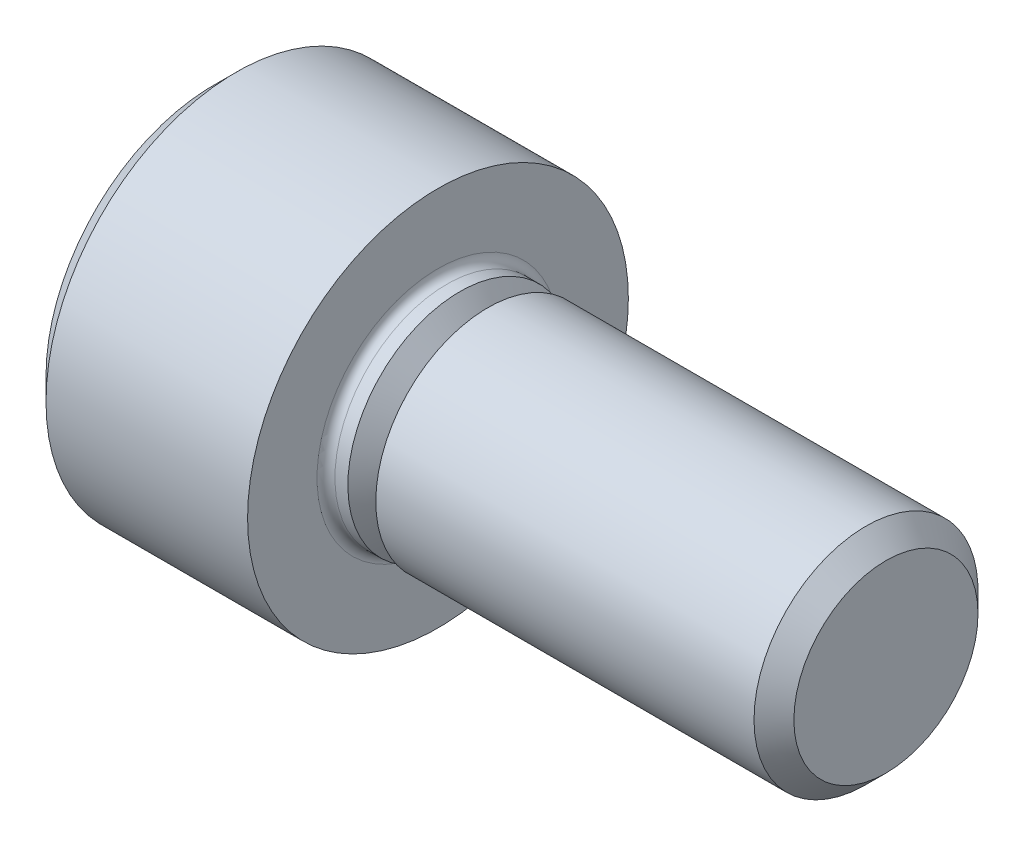
ISO-10303-21;
HEADER;
FILE_DESCRIPTION(('STEP AP214'),'2;1');
FILE_NAME('part.step','',(''),(''),'','','');
FILE_SCHEMA(('AUTOMOTIVE_DESIGN { 1 0 10303 214 1 1 1 1 }'));
ENDSEC;
DATA;
#1=APPLICATION_CONTEXT('core data for automotive mechanical design processes');
#2=APPLICATION_PROTOCOL_DEFINITION('international standard','automotive_design',2000,#1);
#3=PRODUCT_CONTEXT('',#1,'mechanical');
#4=PRODUCT('Part','Part','',(#3));
#5=PRODUCT_RELATED_PRODUCT_CATEGORY('part','',(#4));
#6=PRODUCT_DEFINITION_FORMATION('','',#4);
#7=PRODUCT_DEFINITION_CONTEXT('part definition',#1,'design');
#8=PRODUCT_DEFINITION('design','',#6,#7);
#9=PRODUCT_DEFINITION_SHAPE('','',#8);
#10=(LENGTH_UNIT() NAMED_UNIT(*) SI_UNIT(.MILLI.,.METRE.));
#11=(NAMED_UNIT(*) PLANE_ANGLE_UNIT() SI_UNIT($,.RADIAN.));
#12=(NAMED_UNIT(*) SI_UNIT($,.STERADIAN.) SOLID_ANGLE_UNIT());
#13=UNCERTAINTY_MEASURE_WITH_UNIT(LENGTH_MEASURE(1.E-05),#10,'distance_accuracy_value','');
#14=(GEOMETRIC_REPRESENTATION_CONTEXT(3) GLOBAL_UNCERTAINTY_ASSIGNED_CONTEXT((#13)) GLOBAL_UNIT_ASSIGNED_CONTEXT((#10,
#11,#12)) REPRESENTATION_CONTEXT('',''));
#15=CARTESIAN_POINT('',(0.,0.,0.));
#16=DIRECTION('',(0.,0.,1.));
#17=DIRECTION('',(1.,0.,0.));
#18=AXIS2_PLACEMENT_3D('',#15,#16,#17);
#19=CARTESIAN_POINT('',(0.,0.,0.));
#20=DIRECTION('',(-1.,0.,0.));
#21=DIRECTION('',(0.,0.,1.));
#22=AXIS2_PLACEMENT_3D('',#19,#20,#21);
#23=PLANE('',#22);
#24=DIRECTION('',(0.,-0.5,0.866025403784438));
#25=VECTOR('',#24,1.);
#26=CARTESIAN_POINT('',(0.,2.35789849937043,0.));
#27=LINE('',#26,#25);
#28=CARTESIAN_POINT('',(0.,2.35789849937043,0.));
#29=VERTEX_POINT('',#28);
#30=CARTESIAN_POINT('',(0.,1.17894924968521,2.042));
#31=VERTEX_POINT('',#30);
#32=EDGE_CURVE('E247',#29,#31,#27,.T.);
#33=ORIENTED_EDGE('',*,*,#32,.T.);
#34=DIRECTION('',(0.,1.,0.));
#35=VECTOR('',#34,1.);
#36=CARTESIAN_POINT('',(0.,-1.17894924968522,2.042));
#37=LINE('',#36,#35);
#38=CARTESIAN_POINT('',(0.,-1.17894924968522,2.042));
#39=VERTEX_POINT('',#38);
#40=EDGE_CURVE('E131',#39,#31,#37,.T.);
#41=ORIENTED_EDGE('',*,*,#40,.F.);
#42=DIRECTION('',(0.,-0.500000000000001,-0.866025403784438));
#43=VECTOR('',#42,1.);
#44=CARTESIAN_POINT('',(0.,-1.17894924968522,2.042));
#45=LINE('',#44,#43);
#46=CARTESIAN_POINT('',(0.,-2.35789849937044,0.));
#47=VERTEX_POINT('',#46);
#48=EDGE_CURVE('E266',#39,#47,#45,.T.);
#49=ORIENTED_EDGE('',*,*,#48,.T.);
#50=DIRECTION('',(0.,0.5,-0.866025403784439));
#51=VECTOR('',#50,1.);
#52=CARTESIAN_POINT('',(0.,-2.35789849937044,0.));
#53=LINE('',#52,#51);
#54=CARTESIAN_POINT('',(0.,-1.17894924968522,-2.042));
#55=VERTEX_POINT('',#54);
#56=EDGE_CURVE('E269',#47,#55,#53,.T.);
#57=ORIENTED_EDGE('',*,*,#56,.T.);
#58=DIRECTION('',(0.,-1.,0.));
#59=VECTOR('',#58,1.);
#60=CARTESIAN_POINT('',(0.,1.17894924968521,-2.042));
#61=LINE('',#60,#59);
#62=CARTESIAN_POINT('',(0.,1.17894924968521,-2.042));
#63=VERTEX_POINT('',#62);
#64=EDGE_CURVE('E272',#63,#55,#61,.T.);
#65=ORIENTED_EDGE('',*,*,#64,.F.);
#66=DIRECTION('',(0.,-0.500000000000001,-0.866025403784438));
#67=VECTOR('',#66,1.);
#68=CARTESIAN_POINT('',(0.,2.35789849937043,0.));
#69=LINE('',#68,#67);
#70=EDGE_CURVE('E126',#29,#63,#69,.T.);
#71=ORIENTED_EDGE('',*,*,#70,.F.);
#72=EDGE_LOOP('',(#33,#41,#49,#57,#65,#71));
#73=FACE_BOUND('',#72,.T.);
#74=CARTESIAN_POINT('',(0.,0.,0.));
#75=DIRECTION('',(-1.,0.,0.));
#76=DIRECTION('',(0.,0.,1.));
#77=AXIS2_PLACEMENT_3D('',#74,#75,#76);
#78=CIRCLE('',#77,3.75);
#79=CARTESIAN_POINT('',(0.,0.,3.75));
#80=VERTEX_POINT('',#79);
#81=EDGE_CURVE('E155',#80,#80,#78,.T.);
#82=ORIENTED_EDGE('',*,*,#81,.T.);
#83=EDGE_LOOP('',(#82));
#84=FACE_BOUND('',#83,.T.);
#85=ADVANCED_FACE('F35',(#73,#84),#23,.T.);
#86=CARTESIAN_POINT('',(0.,0.,0.));
#87=DIRECTION('',(1.,0.,0.));
#88=DIRECTION('',(0.,0.,-1.));
#89=AXIS2_PLACEMENT_3D('',#86,#87,#88);
#90=CONICAL_SURFACE('',#89,3.75,0.785398163397446);
#91=CARTESIAN_POINT('',(0.5,0.,0.));
#92=DIRECTION('',(-1.,0.,0.));
#93=DIRECTION('',(0.,0.,1.));
#94=AXIS2_PLACEMENT_3D('',#91,#92,#93);
#95=CIRCLE('',#94,4.25);
#96=CARTESIAN_POINT('',(0.5,0.,4.25));
#97=VERTEX_POINT('',#96);
#98=EDGE_CURVE('E152',#97,#97,#95,.T.);
#99=ORIENTED_EDGE('',*,*,#98,.T.);
#100=EDGE_LOOP('',(#99));
#101=FACE_BOUND('',#100,.T.);
#102=ORIENTED_EDGE('',*,*,#81,.F.);
#103=EDGE_LOOP('',(#102));
#104=FACE_BOUND('',#103,.T.);
#105=ADVANCED_FACE('F176',(#101,#104),#90,.T.);
#106=CARTESIAN_POINT('',(-31.75,0.,0.));
#107=DIRECTION('',(-1.,0.,0.));
#108=DIRECTION('',(0.,0.,1.));
#109=AXIS2_PLACEMENT_3D('',#106,#107,#108);
#110=CYLINDRICAL_SURFACE('',#109,4.25);
#111=CARTESIAN_POINT('',(5.,0.,0.));
#112=DIRECTION('',(-1.,0.,0.));
#113=DIRECTION('',(0.,0.,1.));
#114=AXIS2_PLACEMENT_3D('',#111,#112,#113);
#115=CIRCLE('',#114,4.25);
#116=CARTESIAN_POINT('',(5.,0.,4.25));
#117=VERTEX_POINT('',#116);
#118=EDGE_CURVE('E149',#117,#117,#115,.T.);
#119=ORIENTED_EDGE('',*,*,#118,.T.);
#120=EDGE_LOOP('',(#119));
#121=FACE_BOUND('',#120,.T.);
#122=ORIENTED_EDGE('',*,*,#98,.F.);
#123=EDGE_LOOP('',(#122));
#124=FACE_BOUND('',#123,.T.);
#125=ADVANCED_FACE('F181',(#121,#124),#110,.T.);
#126=CARTESIAN_POINT('',(5.,4.25,0.));
#127=DIRECTION('',(1.,0.,0.));
#128=DIRECTION('',(0.,0.,-1.));
#129=AXIS2_PLACEMENT_3D('',#126,#127,#128);
#130=PLANE('',#129);
#131=CARTESIAN_POINT('',(5.,0.,0.));
#132=DIRECTION('',(1.,0.,0.));
#133=DIRECTION('',(0.,0.,-1.));
#134=AXIS2_PLACEMENT_3D('',#131,#132,#133);
#135=CIRCLE('',#134,2.69999999999996);
#136=CARTESIAN_POINT('',(5.,0.,-2.69999999999996));
#137=VERTEX_POINT('',#136);
#138=EDGE_CURVE('E43',#137,#137,#135,.F.);
#139=ORIENTED_EDGE('',*,*,#138,.T.);
#140=EDGE_LOOP('',(#139));
#141=FACE_BOUND('',#140,.T.);
#142=ORIENTED_EDGE('',*,*,#118,.F.);
#143=EDGE_LOOP('',(#142));
#144=FACE_BOUND('',#143,.T.);
#145=ADVANCED_FACE('F160',(#141,#144),#130,.T.);
#146=CARTESIAN_POINT('',(-31.75,0.,0.));
#147=DIRECTION('',(-1.,0.,0.));
#148=DIRECTION('',(0.,0.,1.));
#149=AXIS2_PLACEMENT_3D('',#146,#147,#148);
#150=CYLINDRICAL_SURFACE('',#149,2.49999999999996);
#151=CARTESIAN_POINT('',(5.48840764549668,0.,0.));
#152=DIRECTION('',(-1.,0.,0.));
#153=DIRECTION('',(0.,-1.,0.));
#154=AXIS2_PLACEMENT_3D('',#151,#152,#153);
#155=CIRCLE('',#154,2.5);
#156=CARTESIAN_POINT('',(5.48840764549668,-2.5,0.));
#157=VERTEX_POINT('',#156);
#158=EDGE_CURVE('E238',#157,#157,#155,.T.);
#159=ORIENTED_EDGE('',*,*,#158,.T.);
#160=EDGE_LOOP('',(#159));
#161=FACE_BOUND('',#160,.T.);
#162=CARTESIAN_POINT('',(5.2,0.,0.));
#163=DIRECTION('',(1.,0.,0.));
#164=DIRECTION('',(0.,0.,-1.));
#165=AXIS2_PLACEMENT_3D('',#162,#163,#164);
#166=CIRCLE('',#165,2.49999999999996);
#167=CARTESIAN_POINT('',(5.2,0.,-2.49999999999996));
#168=VERTEX_POINT('',#167);
#169=EDGE_CURVE('E11',#168,#168,#166,.T.);
#170=ORIENTED_EDGE('',*,*,#169,.T.);
#171=EDGE_LOOP('',(#170));
#172=FACE_BOUND('',#171,.T.);
#173=ADVANCED_FACE('F164',(#161,#172),#150,.T.);
#174=CARTESIAN_POINT('',(5.2,0.,0.));
#175=DIRECTION('',(1.,0.,0.));
#176=DIRECTION('',(0.,0.,-1.));
#177=AXIS2_PLACEMENT_3D('',#174,#175,#176);
#178=TOROIDAL_SURFACE('',#177,2.69999999999996,0.2);
#179=ORIENTED_EDGE('',*,*,#169,.F.);
#180=EDGE_LOOP('',(#179));
#181=FACE_BOUND('',#180,.T.);
#182=ORIENTED_EDGE('',*,*,#138,.F.);
#183=EDGE_LOOP('',(#182));
#184=FACE_BOUND('',#183,.T.);
#185=ADVANCED_FACE('F37',(#181,#184),#178,.F.);
#186=CARTESIAN_POINT('',(2.5,2.35789849937043,0.));
#187=DIRECTION('',(0.,-0.866025403784439,-0.5));
#188=DIRECTION('',(0.,0.5,-0.866025403784439));
#189=AXIS2_PLACEMENT_3D('',#186,#187,#188);
#190=PLANE('',#189);
#191=ORIENTED_EDGE('',*,*,#32,.F.);
#192=DIRECTION('',(-1.,0.,0.));
#193=VECTOR('',#192,1.);
#194=CARTESIAN_POINT('',(2.5,2.35789849937043,0.));
#195=LINE('',#194,#193);
#196=CARTESIAN_POINT('',(2.5,2.35789849937043,0.));
#197=VERTEX_POINT('',#196);
#198=EDGE_CURVE('E263',#197,#29,#195,.T.);
#199=ORIENTED_EDGE('',*,*,#198,.F.);
#200=DIRECTION('',(0.,-0.5,0.866025403784438));
#201=VECTOR('',#200,1.);
#202=CARTESIAN_POINT('',(2.5,2.35789849937043,0.));
#203=LINE('',#202,#201);
#204=CARTESIAN_POINT('',(2.5,1.76842387452782,1.021));
#205=VERTEX_POINT('',#204);
#206=EDGE_CURVE('E118',#197,#205,#203,.T.);
#207=ORIENTED_EDGE('',*,*,#206,.T.);
#208=CARTESIAN_POINT('',(2.5,1.17894924968521,2.042));
#209=VERTEX_POINT('',#208);
#210=EDGE_CURVE('E109',#205,#209,#203,.T.);
#211=ORIENTED_EDGE('',*,*,#210,.T.);
#212=DIRECTION('',(-1.,0.,0.));
#213=VECTOR('',#212,1.);
#214=CARTESIAN_POINT('',(2.5,1.17894924968521,2.042));
#215=LINE('',#214,#213);
#216=EDGE_CURVE('E123',#209,#31,#215,.T.);
#217=ORIENTED_EDGE('',*,*,#216,.T.);
#218=EDGE_LOOP('',(#191,#199,#207,#211,#217));
#219=FACE_BOUND('',#218,.T.);
#220=ADVANCED_FACE('F122',(#219),#190,.T.);
#221=CARTESIAN_POINT('',(2.5,-1.17894924968522,2.042));
#222=DIRECTION('',(0.,0.,1.));
#223=DIRECTION('',(0.,-1.,0.));
#224=AXIS2_PLACEMENT_3D('',#221,#222,#223);
#225=PLANE('',#224);
#226=ORIENTED_EDGE('',*,*,#40,.T.);
#227=ORIENTED_EDGE('',*,*,#216,.F.);
#228=DIRECTION('',(0.,1.,0.));
#229=VECTOR('',#228,1.);
#230=CARTESIAN_POINT('',(2.5,-1.17894924968522,2.042));
#231=LINE('',#230,#229);
#232=CARTESIAN_POINT('',(2.5,0.,2.042));
#233=VERTEX_POINT('',#232);
#234=EDGE_CURVE('E106',#233,#209,#231,.T.);
#235=ORIENTED_EDGE('',*,*,#234,.F.);
#236=CARTESIAN_POINT('',(2.5,-1.17894924968522,2.042));
#237=VERTEX_POINT('',#236);
#238=EDGE_CURVE('E117',#237,#233,#231,.T.);
#239=ORIENTED_EDGE('',*,*,#238,.F.);
#240=DIRECTION('',(-1.,0.,0.));
#241=VECTOR('',#240,1.);
#242=CARTESIAN_POINT('',(2.5,-1.17894924968522,2.042));
#243=LINE('',#242,#241);
#244=EDGE_CURVE('E133',#237,#39,#243,.T.);
#245=ORIENTED_EDGE('',*,*,#244,.T.);
#246=EDGE_LOOP('',(#226,#227,#235,#239,#245));
#247=FACE_BOUND('',#246,.T.);
#248=ADVANCED_FACE('F128',(#247),#225,.F.);
#249=CARTESIAN_POINT('',(2.5,-1.17894924968522,2.042));
#250=DIRECTION('',(0.,0.866025403784438,-0.500000000000001));
#251=DIRECTION('',(0.,0.500000000000001,0.866025403784438));
#252=AXIS2_PLACEMENT_3D('',#249,#250,#251);
#253=PLANE('',#252);
#254=ORIENTED_EDGE('',*,*,#48,.F.);
#255=ORIENTED_EDGE('',*,*,#244,.F.);
#256=DIRECTION('',(0.,-0.500000000000001,-0.866025403784438));
#257=VECTOR('',#256,1.);
#258=CARTESIAN_POINT('',(2.5,-1.17894924968522,2.042));
#259=LINE('',#258,#257);
#260=CARTESIAN_POINT('',(2.5,-1.76842387452782,1.021));
#261=VERTEX_POINT('',#260);
#262=EDGE_CURVE('E250',#237,#261,#259,.T.);
#263=ORIENTED_EDGE('',*,*,#262,.T.);
#264=CARTESIAN_POINT('',(2.5,-2.35789849937044,0.));
#265=VERTEX_POINT('',#264);
#266=EDGE_CURVE('E249',#261,#265,#259,.T.);
#267=ORIENTED_EDGE('',*,*,#266,.T.);
#268=DIRECTION('',(-1.,0.,0.));
#269=VECTOR('',#268,1.);
#270=CARTESIAN_POINT('',(2.5,-2.35789849937044,0.));
#271=LINE('',#270,#269);
#272=EDGE_CURVE('E138',#265,#47,#271,.T.);
#273=ORIENTED_EDGE('',*,*,#272,.T.);
#274=EDGE_LOOP('',(#254,#255,#263,#267,#273));
#275=FACE_BOUND('',#274,.T.);
#276=ADVANCED_FACE('F207',(#275),#253,.T.);
#277=CARTESIAN_POINT('',(2.5,-2.35789849937044,0.));
#278=DIRECTION('',(0.,0.866025403784439,0.5));
#279=DIRECTION('',(0.,-0.5,0.866025403784439));
#280=AXIS2_PLACEMENT_3D('',#277,#278,#279);
#281=PLANE('',#280);
#282=ORIENTED_EDGE('',*,*,#56,.F.);
#283=ORIENTED_EDGE('',*,*,#272,.F.);
#284=DIRECTION('',(0.,0.5,-0.866025403784439));
#285=VECTOR('',#284,1.);
#286=CARTESIAN_POINT('',(2.5,-2.35789849937044,0.));
#287=LINE('',#286,#285);
#288=CARTESIAN_POINT('',(2.5,-1.76842387452783,-1.021));
#289=VERTEX_POINT('',#288);
#290=EDGE_CURVE('E254',#265,#289,#287,.T.);
#291=ORIENTED_EDGE('',*,*,#290,.T.);
#292=CARTESIAN_POINT('',(2.5,-1.17894924968522,-2.042));
#293=VERTEX_POINT('',#292);
#294=EDGE_CURVE('E253',#289,#293,#287,.T.);
#295=ORIENTED_EDGE('',*,*,#294,.T.);
#296=DIRECTION('',(-1.,0.,0.));
#297=VECTOR('',#296,1.);
#298=CARTESIAN_POINT('',(2.5,-1.17894924968522,-2.042));
#299=LINE('',#298,#297);
#300=EDGE_CURVE('E281',#293,#55,#299,.T.);
#301=ORIENTED_EDGE('',*,*,#300,.T.);
#302=EDGE_LOOP('',(#282,#283,#291,#295,#301));
#303=FACE_BOUND('',#302,.T.);
#304=ADVANCED_FACE('F210',(#303),#281,.T.);
#305=CARTESIAN_POINT('',(2.5,1.17894924968521,-2.042));
#306=DIRECTION('',(0.,0.,-1.));
#307=DIRECTION('',(0.,1.,0.));
#308=AXIS2_PLACEMENT_3D('',#305,#306,#307);
#309=PLANE('',#308);
#310=ORIENTED_EDGE('',*,*,#64,.T.);
#311=ORIENTED_EDGE('',*,*,#300,.F.);
#312=DIRECTION('',(0.,-1.,0.));
#313=VECTOR('',#312,1.);
#314=CARTESIAN_POINT('',(2.5,1.17894924968521,-2.042));
#315=LINE('',#314,#313);
#316=CARTESIAN_POINT('',(2.5,0.,-2.042));
#317=VERTEX_POINT('',#316);
#318=EDGE_CURVE('E257',#317,#293,#315,.T.);
#319=ORIENTED_EDGE('',*,*,#318,.F.);
#320=CARTESIAN_POINT('',(2.5,1.17894924968521,-2.042));
#321=VERTEX_POINT('',#320);
#322=EDGE_CURVE('E50',#321,#317,#315,.T.);
#323=ORIENTED_EDGE('',*,*,#322,.F.);
#324=DIRECTION('',(-1.,0.,0.));
#325=VECTOR('',#324,1.);
#326=CARTESIAN_POINT('',(2.5,1.17894924968521,-2.042));
#327=LINE('',#326,#325);
#328=EDGE_CURVE('E278',#321,#63,#327,.T.);
#329=ORIENTED_EDGE('',*,*,#328,.T.);
#330=EDGE_LOOP('',(#310,#311,#319,#323,#329));
#331=FACE_BOUND('',#330,.T.);
#332=ADVANCED_FACE('F214',(#331),#309,.F.);
#333=CARTESIAN_POINT('',(2.5,2.35789849937043,0.));
#334=DIRECTION('',(0.,0.866025403784438,-0.500000000000001));
#335=DIRECTION('',(0.,0.500000000000001,0.866025403784438));
#336=AXIS2_PLACEMENT_3D('',#333,#334,#335);
#337=PLANE('',#336);
#338=ORIENTED_EDGE('',*,*,#70,.T.);
#339=ORIENTED_EDGE('',*,*,#328,.F.);
#340=DIRECTION('',(0.,-0.500000000000001,-0.866025403784438));
#341=VECTOR('',#340,1.);
#342=CARTESIAN_POINT('',(2.5,2.35789849937043,0.));
#343=LINE('',#342,#341);
#344=CARTESIAN_POINT('',(2.5,1.76842387452782,-1.021));
#345=VERTEX_POINT('',#344);
#346=EDGE_CURVE('E259',#345,#321,#343,.T.);
#347=ORIENTED_EDGE('',*,*,#346,.F.);
#348=EDGE_CURVE('E260',#197,#345,#343,.T.);
#349=ORIENTED_EDGE('',*,*,#348,.F.);
#350=ORIENTED_EDGE('',*,*,#198,.T.);
#351=EDGE_LOOP('',(#338,#339,#347,#349,#350));
#352=FACE_BOUND('',#351,.T.);
#353=ADVANCED_FACE('F218',(#352),#337,.F.);
#354=CARTESIAN_POINT('',(2.5,2.35789849937043,0.));
#355=DIRECTION('',(1.,0.,0.));
#356=DIRECTION('',(0.,0.,-1.));
#357=AXIS2_PLACEMENT_3D('',#354,#355,#356);
#358=PLANE('',#357);
#359=ORIENTED_EDGE('',*,*,#318,.T.);
#360=ORIENTED_EDGE('',*,*,#294,.F.);
#361=CARTESIAN_POINT('',(2.5,0.,0.));
#362=DIRECTION('',(-1.,0.,0.));
#363=DIRECTION('',(0.,0.,1.));
#364=AXIS2_PLACEMENT_3D('',#361,#362,#363);
#365=CIRCLE('',#364,2.042);
#366=EDGE_CURVE('E298',#317,#289,#365,.T.);
#367=ORIENTED_EDGE('',*,*,#366,.F.);
#368=EDGE_LOOP('',(#359,#360,#367));
#369=FACE_BOUND('',#368,.T.);
#370=ADVANCED_FACE('F222',(#369),#358,.F.);
#371=ORIENTED_EDGE('',*,*,#290,.F.);
#372=ORIENTED_EDGE('',*,*,#266,.F.);
#373=EDGE_CURVE('E136',#289,#261,#365,.T.);
#374=ORIENTED_EDGE('',*,*,#373,.F.);
#375=EDGE_LOOP('',(#371,#372,#374));
#376=FACE_BOUND('',#375,.T.);
#377=ADVANCED_FACE('F226',(#376),#358,.F.);
#378=ORIENTED_EDGE('',*,*,#262,.F.);
#379=ORIENTED_EDGE('',*,*,#238,.T.);
#380=EDGE_CURVE('E132',#261,#233,#365,.T.);
#381=ORIENTED_EDGE('',*,*,#380,.F.);
#382=EDGE_LOOP('',(#378,#379,#381));
#383=FACE_BOUND('',#382,.T.);
#384=ADVANCED_FACE('F307',(#383),#358,.F.);
#385=ORIENTED_EDGE('',*,*,#234,.T.);
#386=ORIENTED_EDGE('',*,*,#210,.F.);
#387=EDGE_CURVE('E112',#233,#205,#365,.T.);
#388=ORIENTED_EDGE('',*,*,#387,.F.);
#389=EDGE_LOOP('',(#385,#386,#388));
#390=FACE_BOUND('',#389,.T.);
#391=ADVANCED_FACE('F108',(#390),#358,.F.);
#392=ORIENTED_EDGE('',*,*,#206,.F.);
#393=ORIENTED_EDGE('',*,*,#348,.T.);
#394=EDGE_CURVE('E143',#205,#345,#365,.T.);
#395=ORIENTED_EDGE('',*,*,#394,.F.);
#396=EDGE_LOOP('',(#392,#393,#395));
#397=FACE_BOUND('',#396,.T.);
#398=ADVANCED_FACE('F293',(#397),#358,.F.);
#399=ORIENTED_EDGE('',*,*,#346,.T.);
#400=ORIENTED_EDGE('',*,*,#322,.T.);
#401=EDGE_CURVE('E297',#345,#317,#365,.T.);
#402=ORIENTED_EDGE('',*,*,#401,.F.);
#403=EDGE_LOOP('',(#399,#400,#402));
#404=FACE_BOUND('',#403,.T.);
#405=ADVANCED_FACE('F203',(#404),#358,.F.);
#406=CARTESIAN_POINT('',(2.5,0.,0.));
#407=DIRECTION('',(-1.,0.,0.));
#408=DIRECTION('',(0.,0.,1.));
#409=AXIS2_PLACEMENT_3D('',#406,#407,#408);
#410=CONICAL_SURFACE('',#409,2.042,1.04719755119659);
#411=CARTESIAN_POINT('',(3.67894924968522,0.,0.));
#412=VERTEX_POINT('',#411);
#413=VERTEX_LOOP('',#412);
#414=FACE_BOUND('',#413,.T.);
#415=ORIENTED_EDGE('',*,*,#387,.T.);
#416=ORIENTED_EDGE('',*,*,#394,.T.);
#417=ORIENTED_EDGE('',*,*,#401,.T.);
#418=ORIENTED_EDGE('',*,*,#366,.T.);
#419=ORIENTED_EDGE('',*,*,#373,.T.);
#420=ORIENTED_EDGE('',*,*,#380,.T.);
#421=EDGE_LOOP('',(#415,#416,#417,#418,#419,#420));
#422=FACE_BOUND('',#421,.T.);
#423=ADVANCED_FACE('F200',(#414,#422),#410,.F.);
#424=CARTESIAN_POINT('',(6.11159235450332,0.,0.));
#425=DIRECTION('',(1.,0.,0.));
#426=DIRECTION('',(0.,1.,0.));
#427=AXIS2_PLACEMENT_3D('',#424,#425,#426);
#428=CONICAL_SURFACE('',#427,2.5,0.959931088596884);
#429=CARTESIAN_POINT('',(5.8,0.,0.));
#430=DIRECTION('',(-1.,0.,0.));
#431=DIRECTION('',(0.,-1.,0.));
#432=AXIS2_PLACEMENT_3D('',#429,#430,#431);
#433=CIRCLE('',#432,2.055);
#434=CARTESIAN_POINT('',(5.8,-2.055,0.));
#435=VERTEX_POINT('',#434);
#436=EDGE_CURVE('E241',#435,#435,#433,.T.);
#437=ORIENTED_EDGE('',*,*,#436,.F.);
#438=EDGE_LOOP('',(#437));
#439=FACE_BOUND('',#438,.T.);
#440=CARTESIAN_POINT('',(6.11159235450332,0.,0.));
#441=DIRECTION('',(-1.,0.,0.));
#442=DIRECTION('',(0.,-1.,0.));
#443=AXIS2_PLACEMENT_3D('',#440,#441,#442);
#444=CIRCLE('',#443,2.5);
#445=CARTESIAN_POINT('',(6.11159235450332,-2.5,0.));
#446=VERTEX_POINT('',#445);
#447=EDGE_CURVE('E243',#446,#446,#444,.T.);
#448=ORIENTED_EDGE('',*,*,#447,.T.);
#449=EDGE_LOOP('',(#448));
#450=FACE_BOUND('',#449,.T.);
#451=ADVANCED_FACE('F202',(#439,#450),#428,.T.);
#452=CARTESIAN_POINT('',(5.8,0.,0.));
#453=DIRECTION('',(-1.,0.,0.));
#454=DIRECTION('',(0.,-1.,0.));
#455=AXIS2_PLACEMENT_3D('',#452,#453,#454);
#456=CONICAL_SURFACE('',#455,2.055,0.959931088596876);
#457=ORIENTED_EDGE('',*,*,#158,.F.);
#458=EDGE_LOOP('',(#457));
#459=FACE_BOUND('',#458,.T.);
#460=ORIENTED_EDGE('',*,*,#436,.T.);
#461=EDGE_LOOP('',(#460));
#462=FACE_BOUND('',#461,.T.);
#463=ADVANCED_FACE('F198',(#459,#462),#456,.T.);
#464=CARTESIAN_POINT('',(15.,2.055,0.));
#465=DIRECTION('',(1.,0.,0.));
#466=DIRECTION('',(0.,0.,-1.));
#467=AXIS2_PLACEMENT_3D('',#464,#465,#466);
#468=PLANE('',#467);
#469=CARTESIAN_POINT('',(15.,0.,0.));
#470=DIRECTION('',(-1.,0.,0.));
#471=DIRECTION('',(0.,0.,1.));
#472=AXIS2_PLACEMENT_3D('',#469,#470,#471);
#473=CIRCLE('',#472,2.055);
#474=CARTESIAN_POINT('',(15.,0.,2.055));
#475=VERTEX_POINT('',#474);
#476=EDGE_CURVE('E142',#475,#475,#473,.T.);
#477=ORIENTED_EDGE('',*,*,#476,.F.);
#478=EDGE_LOOP('',(#477));
#479=FACE_BOUND('',#478,.T.);
#480=ADVANCED_FACE('F194',(#479),#468,.T.);
#481=CARTESIAN_POINT('',(15.,0.,0.));
#482=DIRECTION('',(-1.,0.,0.));
#483=DIRECTION('',(0.,0.,1.));
#484=AXIS2_PLACEMENT_3D('',#481,#482,#483);
#485=CONICAL_SURFACE('',#484,2.055,0.785398163397301);
#486=CARTESIAN_POINT('',(14.5549999999999,0.,0.));
#487=DIRECTION('',(-1.,0.,0.));
#488=DIRECTION('',(0.,0.,1.));
#489=AXIS2_PLACEMENT_3D('',#486,#487,#488);
#490=CIRCLE('',#489,2.49999999999993);
#491=CARTESIAN_POINT('',(14.5549999999999,0.,2.49999999999993));
#492=VERTEX_POINT('',#491);
#493=EDGE_CURVE('E146',#492,#492,#490,.T.);
#494=ORIENTED_EDGE('',*,*,#493,.F.);
#495=EDGE_LOOP('',(#494));
#496=FACE_BOUND('',#495,.T.);
#497=ORIENTED_EDGE('',*,*,#476,.T.);
#498=EDGE_LOOP('',(#497));
#499=FACE_BOUND('',#498,.T.);
#500=ADVANCED_FACE('F191',(#496,#499),#485,.T.);
#501=ORIENTED_EDGE('',*,*,#447,.F.);
#502=EDGE_LOOP('',(#501));
#503=FACE_BOUND('',#502,.T.);
#504=ORIENTED_EDGE('',*,*,#493,.T.);
#505=EDGE_LOOP('',(#504));
#506=FACE_BOUND('',#505,.T.);
#507=ADVANCED_FACE('F173',(#503,#506),#150,.T.);
#508=CLOSED_SHELL('',(#85,#105,#125,#145,#173,#185,#220,#248,#276,#304,#332,#353,#370,#377,#384,
#391,#398,#405,#423,#451,#463,#480,#500,#507));
#509=MANIFOLD_SOLID_BREP('B2',#508);
#510=ADVANCED_BREP_SHAPE_REPRESENTATION('',(#18,#509),#14);
#511=SHAPE_DEFINITION_REPRESENTATION(#9,#510);
ENDSEC;
END-ISO-10303-21;
